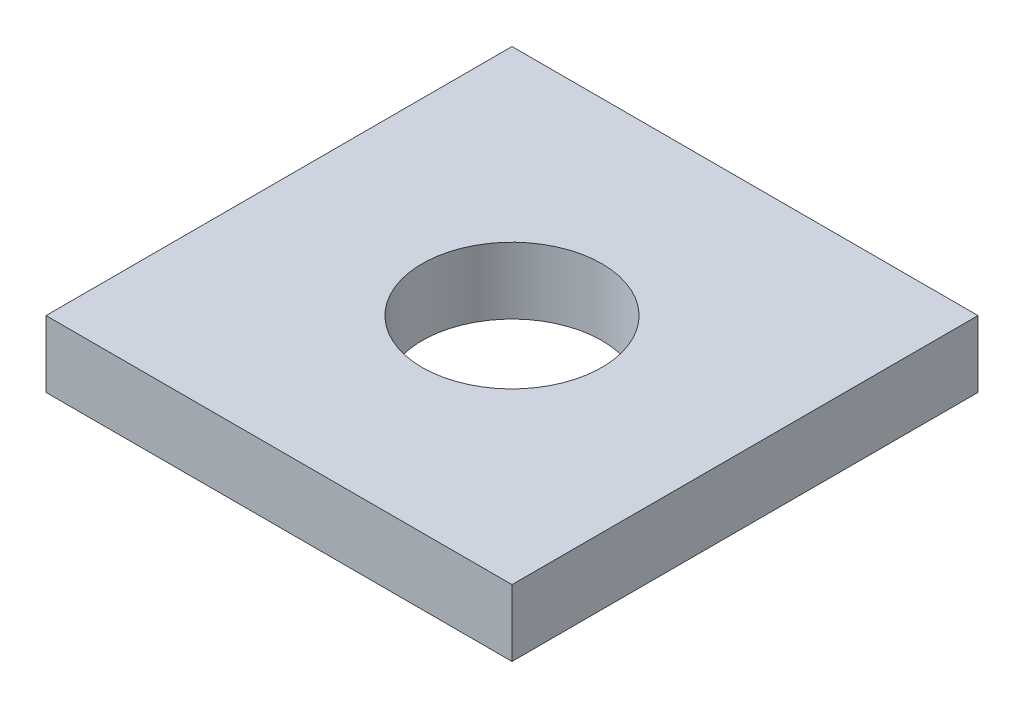
ISO-10303-21;
HEADER;
FILE_DESCRIPTION(('STEP AP214'),'2;1');
FILE_NAME('part.step','',(''),(''),'','','');
FILE_SCHEMA(('AUTOMOTIVE_DESIGN { 1 0 10303 214 1 1 1 1 }'));
ENDSEC;
DATA;
#1=APPLICATION_CONTEXT('core data for automotive mechanical design processes');
#2=APPLICATION_PROTOCOL_DEFINITION('international standard','automotive_design',2000,#1);
#3=PRODUCT_CONTEXT('',#1,'mechanical');
#4=PRODUCT('Part','Part','',(#3));
#5=PRODUCT_RELATED_PRODUCT_CATEGORY('part','',(#4));
#6=PRODUCT_DEFINITION_FORMATION('','',#4);
#7=PRODUCT_DEFINITION_CONTEXT('part definition',#1,'design');
#8=PRODUCT_DEFINITION('design','',#6,#7);
#9=PRODUCT_DEFINITION_SHAPE('','',#8);
#10=(LENGTH_UNIT() NAMED_UNIT(*) SI_UNIT(.MILLI.,.METRE.));
#11=(NAMED_UNIT(*) PLANE_ANGLE_UNIT() SI_UNIT($,.RADIAN.));
#12=(NAMED_UNIT(*) SI_UNIT($,.STERADIAN.) SOLID_ANGLE_UNIT());
#13=UNCERTAINTY_MEASURE_WITH_UNIT(LENGTH_MEASURE(1.E-05),#10,'distance_accuracy_value','');
#14=(GEOMETRIC_REPRESENTATION_CONTEXT(3) GLOBAL_UNCERTAINTY_ASSIGNED_CONTEXT((#13)) GLOBAL_UNIT_ASSIGNED_CONTEXT((#10,
#11,#12)) REPRESENTATION_CONTEXT('',''));
#15=CARTESIAN_POINT('',(0.,0.,0.));
#16=DIRECTION('',(0.,0.,1.));
#17=DIRECTION('',(1.,0.,0.));
#18=AXIS2_PLACEMENT_3D('',#15,#16,#17);
#19=CARTESIAN_POINT('',(0.,1.,0.));
#20=DIRECTION('',(0.,1.,0.));
#21=DIRECTION('',(0.,0.,1.));
#22=AXIS2_PLACEMENT_3D('',#19,#20,#21);
#23=PLANE('',#22);
#24=DIRECTION('',(0.,0.,1.));
#25=VECTOR('',#24,1.);
#26=CARTESIAN_POINT('',(-3.5,1.,-3.5));
#27=LINE('',#26,#25);
#28=CARTESIAN_POINT('',(-3.5,1.,-3.5));
#29=VERTEX_POINT('',#28);
#30=CARTESIAN_POINT('',(-3.5,1.,3.5));
#31=VERTEX_POINT('',#30);
#32=EDGE_CURVE('E102',#29,#31,#27,.T.);
#33=ORIENTED_EDGE('',*,*,#32,.T.);
#34=DIRECTION('',(1.,0.,0.));
#35=VECTOR('',#34,1.);
#36=CARTESIAN_POINT('',(-3.5,1.,3.5));
#37=LINE('',#36,#35);
#38=CARTESIAN_POINT('',(3.5,1.,3.5));
#39=VERTEX_POINT('',#38);
#40=EDGE_CURVE('E94',#31,#39,#37,.T.);
#41=ORIENTED_EDGE('',*,*,#40,.T.);
#42=DIRECTION('',(0.,0.,1.));
#43=VECTOR('',#42,1.);
#44=CARTESIAN_POINT('',(3.5,1.,-3.5));
#45=LINE('',#44,#43);
#46=CARTESIAN_POINT('',(3.5,1.,-3.5));
#47=VERTEX_POINT('',#46);
#48=EDGE_CURVE('E101',#47,#39,#45,.T.);
#49=ORIENTED_EDGE('',*,*,#48,.F.);
#50=DIRECTION('',(1.,0.,0.));
#51=VECTOR('',#50,1.);
#52=CARTESIAN_POINT('',(-3.5,1.,-3.5));
#53=LINE('',#52,#51);
#54=EDGE_CURVE('E111',#29,#47,#53,.T.);
#55=ORIENTED_EDGE('',*,*,#54,.F.);
#56=EDGE_LOOP('',(#33,#41,#49,#55));
#57=FACE_BOUND('',#56,.T.);
#58=CARTESIAN_POINT('',(0.,1.,0.));
#59=DIRECTION('',(0.,1.,0.));
#60=DIRECTION('',(0.,0.,1.));
#61=AXIS2_PLACEMENT_3D('',#58,#59,#60);
#62=CIRCLE('',#61,1.35);
#63=CARTESIAN_POINT('',(0.,1.,1.35000000000001));
#64=VERTEX_POINT('',#63);
#65=EDGE_CURVE('E118',#64,#64,#62,.T.);
#66=ORIENTED_EDGE('',*,*,#65,.F.);
#67=EDGE_LOOP('',(#66));
#68=FACE_BOUND('',#67,.T.);
#69=ADVANCED_FACE('F52',(#57,#68),#23,.T.);
#70=CARTESIAN_POINT('',(0.,0.,0.));
#71=DIRECTION('',(0.,1.,0.));
#72=DIRECTION('',(0.,0.,1.));
#73=AXIS2_PLACEMENT_3D('',#70,#71,#72);
#74=PLANE('',#73);
#75=DIRECTION('',(0.,0.,1.));
#76=VECTOR('',#75,1.);
#77=CARTESIAN_POINT('',(-3.5,0.,-3.5));
#78=LINE('',#77,#76);
#79=CARTESIAN_POINT('',(-3.5,0.,-3.5));
#80=VERTEX_POINT('',#79);
#81=CARTESIAN_POINT('',(-3.5,0.,3.5));
#82=VERTEX_POINT('',#81);
#83=EDGE_CURVE('E116',#80,#82,#78,.T.);
#84=ORIENTED_EDGE('',*,*,#83,.F.);
#85=DIRECTION('',(1.,0.,0.));
#86=VECTOR('',#85,1.);
#87=CARTESIAN_POINT('',(-3.5,0.,-3.5));
#88=LINE('',#87,#86);
#89=CARTESIAN_POINT('',(3.5,0.,-3.5));
#90=VERTEX_POINT('',#89);
#91=EDGE_CURVE('E122',#80,#90,#88,.T.);
#92=ORIENTED_EDGE('',*,*,#91,.T.);
#93=DIRECTION('',(0.,0.,1.));
#94=VECTOR('',#93,1.);
#95=CARTESIAN_POINT('',(3.5,0.,-3.5));
#96=LINE('',#95,#94);
#97=CARTESIAN_POINT('',(3.5,0.,3.5));
#98=VERTEX_POINT('',#97);
#99=EDGE_CURVE('E120',#90,#98,#96,.T.);
#100=ORIENTED_EDGE('',*,*,#99,.T.);
#101=DIRECTION('',(1.,0.,0.));
#102=VECTOR('',#101,1.);
#103=CARTESIAN_POINT('',(-3.5,0.,3.5));
#104=LINE('',#103,#102);
#105=EDGE_CURVE('E107',#82,#98,#104,.T.);
#106=ORIENTED_EDGE('',*,*,#105,.F.);
#107=EDGE_LOOP('',(#84,#92,#100,#106));
#108=FACE_BOUND('',#107,.T.);
#109=CARTESIAN_POINT('',(0.,0.,0.));
#110=DIRECTION('',(0.,1.,0.));
#111=DIRECTION('',(0.,0.,1.));
#112=AXIS2_PLACEMENT_3D('',#109,#110,#111);
#113=CIRCLE('',#112,1.35);
#114=CARTESIAN_POINT('',(0.,0.,1.35000000000001));
#115=VERTEX_POINT('',#114);
#116=EDGE_CURVE('E128',#115,#115,#113,.T.);
#117=ORIENTED_EDGE('',*,*,#116,.T.);
#118=EDGE_LOOP('',(#117));
#119=FACE_BOUND('',#118,.T.);
#120=ADVANCED_FACE('F137',(#108,#119),#74,.F.);
#121=CARTESIAN_POINT('',(-3.5,1.,-3.5));
#122=DIRECTION('',(1.,0.,0.));
#123=DIRECTION('',(0.,0.,-1.));
#124=AXIS2_PLACEMENT_3D('',#121,#122,#123);
#125=PLANE('',#124);
#126=ORIENTED_EDGE('',*,*,#83,.T.);
#127=DIRECTION('',(0.,-1.,0.));
#128=VECTOR('',#127,1.);
#129=CARTESIAN_POINT('',(-3.5,1.,3.5));
#130=LINE('',#129,#128);
#131=EDGE_CURVE('E12',#31,#82,#130,.T.);
#132=ORIENTED_EDGE('',*,*,#131,.F.);
#133=ORIENTED_EDGE('',*,*,#32,.F.);
#134=DIRECTION('',(0.,-1.,0.));
#135=VECTOR('',#134,1.);
#136=CARTESIAN_POINT('',(-3.5,1.,-3.5));
#137=LINE('',#136,#135);
#138=EDGE_CURVE('E69',#29,#80,#137,.T.);
#139=ORIENTED_EDGE('',*,*,#138,.T.);
#140=EDGE_LOOP('',(#126,#132,#133,#139));
#141=FACE_BOUND('',#140,.T.);
#142=ADVANCED_FACE('F54',(#141),#125,.F.);
#143=CARTESIAN_POINT('',(-3.5,1.,3.5));
#144=DIRECTION('',(0.,0.,-1.));
#145=DIRECTION('',(-1.,0.,0.));
#146=AXIS2_PLACEMENT_3D('',#143,#144,#145);
#147=PLANE('',#146);
#148=ORIENTED_EDGE('',*,*,#105,.T.);
#149=DIRECTION('',(0.,-1.,0.));
#150=VECTOR('',#149,1.);
#151=CARTESIAN_POINT('',(3.5,1.,3.5));
#152=LINE('',#151,#150);
#153=EDGE_CURVE('E61',#39,#98,#152,.T.);
#154=ORIENTED_EDGE('',*,*,#153,.F.);
#155=ORIENTED_EDGE('',*,*,#40,.F.);
#156=ORIENTED_EDGE('',*,*,#131,.T.);
#157=EDGE_LOOP('',(#148,#154,#155,#156));
#158=FACE_BOUND('',#157,.T.);
#159=ADVANCED_FACE('F106',(#158),#147,.F.);
#160=CARTESIAN_POINT('',(3.5,1.,-3.5));
#161=DIRECTION('',(1.,0.,0.));
#162=DIRECTION('',(0.,0.,-1.));
#163=AXIS2_PLACEMENT_3D('',#160,#161,#162);
#164=PLANE('',#163);
#165=ORIENTED_EDGE('',*,*,#99,.F.);
#166=DIRECTION('',(0.,-1.,0.));
#167=VECTOR('',#166,1.);
#168=CARTESIAN_POINT('',(3.5,1.,-3.5));
#169=LINE('',#168,#167);
#170=EDGE_CURVE('E83',#47,#90,#169,.T.);
#171=ORIENTED_EDGE('',*,*,#170,.F.);
#172=ORIENTED_EDGE('',*,*,#48,.T.);
#173=ORIENTED_EDGE('',*,*,#153,.T.);
#174=EDGE_LOOP('',(#165,#171,#172,#173));
#175=FACE_BOUND('',#174,.T.);
#176=ADVANCED_FACE('F110',(#175),#164,.T.);
#177=CARTESIAN_POINT('',(-3.5,1.,-3.5));
#178=DIRECTION('',(0.,0.,-1.));
#179=DIRECTION('',(-1.,0.,0.));
#180=AXIS2_PLACEMENT_3D('',#177,#178,#179);
#181=PLANE('',#180);
#182=ORIENTED_EDGE('',*,*,#91,.F.);
#183=ORIENTED_EDGE('',*,*,#138,.F.);
#184=ORIENTED_EDGE('',*,*,#54,.T.);
#185=ORIENTED_EDGE('',*,*,#170,.T.);
#186=EDGE_LOOP('',(#182,#183,#184,#185));
#187=FACE_BOUND('',#186,.T.);
#188=ADVANCED_FACE('F145',(#187),#181,.T.);
#189=CARTESIAN_POINT('',(0.,1.,0.));
#190=DIRECTION('',(0.,-1.,0.));
#191=DIRECTION('',(0.,0.,-1.));
#192=AXIS2_PLACEMENT_3D('',#189,#190,#191);
#193=CYLINDRICAL_SURFACE('',#192,1.35);
#194=ORIENTED_EDGE('',*,*,#65,.T.);
#195=EDGE_LOOP('',(#194));
#196=FACE_BOUND('',#195,.T.);
#197=ORIENTED_EDGE('',*,*,#116,.F.);
#198=EDGE_LOOP('',(#197));
#199=FACE_BOUND('',#198,.T.);
#200=ADVANCED_FACE('F134',(#196,#199),#193,.F.);
#201=CLOSED_SHELL('',(#69,#120,#142,#159,#176,#188,#200));
#202=MANIFOLD_SOLID_BREP('B2',#201);
#203=ADVANCED_BREP_SHAPE_REPRESENTATION('',(#18,#202),#14);
#204=SHAPE_DEFINITION_REPRESENTATION(#9,#203);
ENDSEC;
END-ISO-10303-21;
